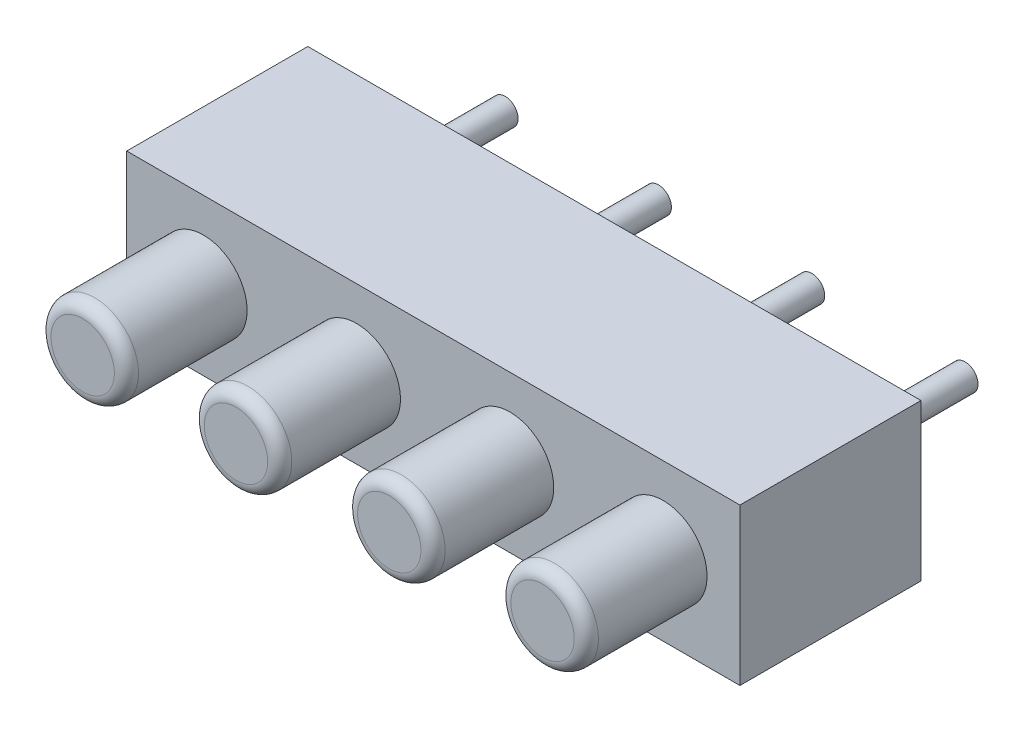
ISO-10303-21;
HEADER;
FILE_DESCRIPTION(('STEP AP214'),'2;1');
FILE_NAME('part.step','',(''),(''),'','','');
FILE_SCHEMA(('AUTOMOTIVE_DESIGN { 1 0 10303 214 1 1 1 1 }'));
ENDSEC;
DATA;
#1=APPLICATION_CONTEXT('core data for automotive mechanical design processes');
#2=APPLICATION_PROTOCOL_DEFINITION('international standard','automotive_design',2000,#1);
#3=PRODUCT_CONTEXT('',#1,'mechanical');
#4=PRODUCT('Part','Part','',(#3));
#5=PRODUCT_RELATED_PRODUCT_CATEGORY('part','',(#4));
#6=PRODUCT_DEFINITION_FORMATION('','',#4);
#7=PRODUCT_DEFINITION_CONTEXT('part definition',#1,'design');
#8=PRODUCT_DEFINITION('design','',#6,#7);
#9=PRODUCT_DEFINITION_SHAPE('','',#8);
#10=(LENGTH_UNIT() NAMED_UNIT(*) SI_UNIT(.MILLI.,.METRE.));
#11=(NAMED_UNIT(*) PLANE_ANGLE_UNIT() SI_UNIT($,.RADIAN.));
#12=(NAMED_UNIT(*) SI_UNIT($,.STERADIAN.) SOLID_ANGLE_UNIT());
#13=UNCERTAINTY_MEASURE_WITH_UNIT(LENGTH_MEASURE(1.E-05),#10,'distance_accuracy_value','');
#14=(GEOMETRIC_REPRESENTATION_CONTEXT(3) GLOBAL_UNCERTAINTY_ASSIGNED_CONTEXT((#13)) GLOBAL_UNIT_ASSIGNED_CONTEXT((#10,
#11,#12)) REPRESENTATION_CONTEXT('',''));
#15=CARTESIAN_POINT('',(0.,0.,0.));
#16=DIRECTION('',(0.,0.,1.));
#17=DIRECTION('',(1.,0.,0.));
#18=AXIS2_PLACEMENT_3D('',#15,#16,#17);
#19=CARTESIAN_POINT('',(0.,0.,0.));
#20=DIRECTION('',(0.,0.,-1.));
#21=DIRECTION('',(-1.,0.,0.));
#22=AXIS2_PLACEMENT_3D('',#19,#20,#21);
#23=PLANE('',#22);
#24=CARTESIAN_POINT('',(6.35,1.295,0.));
#25=DIRECTION('',(0.,0.,-1.));
#26=DIRECTION('',(-1.,0.,0.));
#27=AXIS2_PLACEMENT_3D('',#24,#25,#26);
#28=CIRCLE('',#27,0.215);
#29=CARTESIAN_POINT('',(6.135,1.295,0.));
#30=VERTEX_POINT('',#29);
#31=EDGE_CURVE('E430',#30,#30,#28,.T.);
#32=ORIENTED_EDGE('',*,*,#31,.F.);
#33=EDGE_LOOP('',(#32));
#34=FACE_BOUND('',#33,.T.);
#35=CARTESIAN_POINT('',(1.27,1.295,0.));
#36=DIRECTION('',(0.,0.,-1.));
#37=DIRECTION('',(-1.,0.,0.));
#38=AXIS2_PLACEMENT_3D('',#35,#36,#37);
#39=CIRCLE('',#38,0.215);
#40=CARTESIAN_POINT('',(1.055,1.295,0.));
#41=VERTEX_POINT('',#40);
#42=EDGE_CURVE('E419',#41,#41,#39,.T.);
#43=ORIENTED_EDGE('',*,*,#42,.F.);
#44=EDGE_LOOP('',(#43));
#45=FACE_BOUND('',#44,.T.);
#46=DIRECTION('',(0.,-1.,0.));
#47=VECTOR('',#46,1.);
#48=CARTESIAN_POINT('',(0.,0.,0.));
#49=LINE('',#48,#47);
#50=CARTESIAN_POINT('',(0.,2.59,0.));
#51=VERTEX_POINT('',#50);
#52=CARTESIAN_POINT('',(0.,0.,0.));
#53=VERTEX_POINT('',#52);
#54=EDGE_CURVE('E106',#51,#53,#49,.T.);
#55=ORIENTED_EDGE('',*,*,#54,.F.);
#56=DIRECTION('',(-1.,0.,0.));
#57=VECTOR('',#56,1.);
#58=CARTESIAN_POINT('',(0.,2.59,0.));
#59=LINE('',#58,#57);
#60=CARTESIAN_POINT('',(10.16,2.59,0.));
#61=VERTEX_POINT('',#60);
#62=EDGE_CURVE('E77',#61,#51,#59,.T.);
#63=ORIENTED_EDGE('',*,*,#62,.F.);
#64=DIRECTION('',(0.,1.,0.));
#65=VECTOR('',#64,1.);
#66=CARTESIAN_POINT('',(10.16,0.,0.));
#67=LINE('',#66,#65);
#68=CARTESIAN_POINT('',(10.16,0.,0.));
#69=VERTEX_POINT('',#68);
#70=EDGE_CURVE('E71',#69,#61,#67,.T.);
#71=ORIENTED_EDGE('',*,*,#70,.F.);
#72=DIRECTION('',(1.,0.,0.));
#73=VECTOR('',#72,1.);
#74=CARTESIAN_POINT('',(0.,0.,0.));
#75=LINE('',#74,#73);
#76=EDGE_CURVE('E96',#53,#69,#75,.T.);
#77=ORIENTED_EDGE('',*,*,#76,.F.);
#78=EDGE_LOOP('',(#55,#63,#71,#77));
#79=FACE_BOUND('',#78,.T.);
#80=CARTESIAN_POINT('',(3.81,1.295,0.));
#81=DIRECTION('',(0.,0.,-1.));
#82=DIRECTION('',(-1.,0.,0.));
#83=AXIS2_PLACEMENT_3D('',#80,#81,#82);
#84=CIRCLE('',#83,0.215);
#85=CARTESIAN_POINT('',(3.595,1.295,0.));
#86=VERTEX_POINT('',#85);
#87=EDGE_CURVE('E424',#86,#86,#84,.T.);
#88=ORIENTED_EDGE('',*,*,#87,.F.);
#89=EDGE_LOOP('',(#88));
#90=FACE_BOUND('',#89,.T.);
#91=CARTESIAN_POINT('',(8.89,1.295,0.));
#92=DIRECTION('',(0.,0.,-1.));
#93=DIRECTION('',(-1.,0.,0.));
#94=AXIS2_PLACEMENT_3D('',#91,#92,#93);
#95=CIRCLE('',#94,0.214999999999999);
#96=CARTESIAN_POINT('',(8.675,1.295,0.));
#97=VERTEX_POINT('',#96);
#98=EDGE_CURVE('E436',#97,#97,#95,.T.);
#99=ORIENTED_EDGE('',*,*,#98,.F.);
#100=EDGE_LOOP('',(#99));
#101=FACE_BOUND('',#100,.T.);
#102=ADVANCED_FACE('F37',(#34,#45,#79,#90,#101),#23,.T.);
#103=CARTESIAN_POINT('',(0.,0.,3.));
#104=DIRECTION('',(0.,0.,-1.));
#105=DIRECTION('',(-1.,0.,0.));
#106=AXIS2_PLACEMENT_3D('',#103,#104,#105);
#107=PLANE('',#106);
#108=CARTESIAN_POINT('',(6.35,1.295,3.));
#109=DIRECTION('',(0.,0.,-1.));
#110=DIRECTION('',(-1.,0.,0.));
#111=AXIS2_PLACEMENT_3D('',#108,#109,#110);
#112=CIRCLE('',#111,0.725);
#113=CARTESIAN_POINT('',(5.625,1.295,3.));
#114=VERTEX_POINT('',#113);
#115=EDGE_CURVE('E122',#114,#114,#112,.F.);
#116=ORIENTED_EDGE('',*,*,#115,.F.);
#117=EDGE_LOOP('',(#116));
#118=FACE_BOUND('',#117,.T.);
#119=CARTESIAN_POINT('',(1.27,1.295,3.));
#120=DIRECTION('',(0.,0.,-1.));
#121=DIRECTION('',(-1.,0.,0.));
#122=AXIS2_PLACEMENT_3D('',#119,#120,#121);
#123=CIRCLE('',#122,0.725);
#124=CARTESIAN_POINT('',(0.545000000000001,1.295,3.));
#125=VERTEX_POINT('',#124);
#126=EDGE_CURVE('E116',#125,#125,#123,.F.);
#127=ORIENTED_EDGE('',*,*,#126,.F.);
#128=EDGE_LOOP('',(#127));
#129=FACE_BOUND('',#128,.T.);
#130=DIRECTION('',(0.,-1.,0.));
#131=VECTOR('',#130,1.);
#132=CARTESIAN_POINT('',(0.,0.,3.));
#133=LINE('',#132,#131);
#134=CARTESIAN_POINT('',(0.,2.59,3.));
#135=VERTEX_POINT('',#134);
#136=CARTESIAN_POINT('',(0.,0.,3.));
#137=VERTEX_POINT('',#136);
#138=EDGE_CURVE('E91',#135,#137,#133,.T.);
#139=ORIENTED_EDGE('',*,*,#138,.T.);
#140=DIRECTION('',(1.,0.,0.));
#141=VECTOR('',#140,1.);
#142=CARTESIAN_POINT('',(0.,0.,3.));
#143=LINE('',#142,#141);
#144=CARTESIAN_POINT('',(10.16,0.,3.));
#145=VERTEX_POINT('',#144);
#146=EDGE_CURVE('E85',#137,#145,#143,.T.);
#147=ORIENTED_EDGE('',*,*,#146,.T.);
#148=DIRECTION('',(0.,1.,0.));
#149=VECTOR('',#148,1.);
#150=CARTESIAN_POINT('',(10.16,0.,3.));
#151=LINE('',#150,#149);
#152=CARTESIAN_POINT('',(10.16,2.59,3.));
#153=VERTEX_POINT('',#152);
#154=EDGE_CURVE('E89',#145,#153,#151,.T.);
#155=ORIENTED_EDGE('',*,*,#154,.T.);
#156=DIRECTION('',(-1.,0.,0.));
#157=VECTOR('',#156,1.);
#158=CARTESIAN_POINT('',(0.,2.59,3.));
#159=LINE('',#158,#157);
#160=EDGE_CURVE('E54',#153,#135,#159,.T.);
#161=ORIENTED_EDGE('',*,*,#160,.T.);
#162=EDGE_LOOP('',(#139,#147,#155,#161));
#163=FACE_BOUND('',#162,.T.);
#164=CARTESIAN_POINT('',(3.81,1.295,3.));
#165=DIRECTION('',(0.,0.,-1.));
#166=DIRECTION('',(-1.,0.,0.));
#167=AXIS2_PLACEMENT_3D('',#164,#165,#166);
#168=CIRCLE('',#167,0.725);
#169=CARTESIAN_POINT('',(3.085,1.295,3.));
#170=VERTEX_POINT('',#169);
#171=EDGE_CURVE('E119',#170,#170,#168,.F.);
#172=ORIENTED_EDGE('',*,*,#171,.F.);
#173=EDGE_LOOP('',(#172));
#174=FACE_BOUND('',#173,.T.);
#175=CARTESIAN_POINT('',(8.89,1.295,3.));
#176=DIRECTION('',(0.,0.,-1.));
#177=DIRECTION('',(-1.,0.,0.));
#178=AXIS2_PLACEMENT_3D('',#175,#176,#177);
#179=CIRCLE('',#178,0.725);
#180=CARTESIAN_POINT('',(8.165,1.295,3.));
#181=VERTEX_POINT('',#180);
#182=EDGE_CURVE('E125',#181,#181,#179,.F.);
#183=ORIENTED_EDGE('',*,*,#182,.F.);
#184=EDGE_LOOP('',(#183));
#185=FACE_BOUND('',#184,.T.);
#186=ADVANCED_FACE('F86',(#118,#129,#163,#174,#185),#107,.F.);
#187=CARTESIAN_POINT('',(0.,0.,3.));
#188=DIRECTION('',(1.,0.,0.));
#189=DIRECTION('',(0.,0.,-1.));
#190=AXIS2_PLACEMENT_3D('',#187,#188,#189);
#191=PLANE('',#190);
#192=ORIENTED_EDGE('',*,*,#54,.T.);
#193=DIRECTION('',(0.,0.,-1.));
#194=VECTOR('',#193,1.);
#195=CARTESIAN_POINT('',(0.,0.,3.));
#196=LINE('',#195,#194);
#197=EDGE_CURVE('E97',#137,#53,#196,.T.);
#198=ORIENTED_EDGE('',*,*,#197,.F.);
#199=ORIENTED_EDGE('',*,*,#138,.F.);
#200=DIRECTION('',(0.,0.,-1.));
#201=VECTOR('',#200,1.);
#202=CARTESIAN_POINT('',(0.,2.59,3.));
#203=LINE('',#202,#201);
#204=EDGE_CURVE('E102',#135,#51,#203,.T.);
#205=ORIENTED_EDGE('',*,*,#204,.T.);
#206=EDGE_LOOP('',(#192,#198,#199,#205));
#207=FACE_BOUND('',#206,.T.);
#208=ADVANCED_FACE('F166',(#207),#191,.F.);
#209=CARTESIAN_POINT('',(0.,0.,3.));
#210=DIRECTION('',(0.,1.,0.));
#211=DIRECTION('',(0.,0.,1.));
#212=AXIS2_PLACEMENT_3D('',#209,#210,#211);
#213=PLANE('',#212);
#214=ORIENTED_EDGE('',*,*,#76,.T.);
#215=DIRECTION('',(0.,0.,-1.));
#216=VECTOR('',#215,1.);
#217=CARTESIAN_POINT('',(10.16,0.,3.));
#218=LINE('',#217,#216);
#219=EDGE_CURVE('E94',#145,#69,#218,.T.);
#220=ORIENTED_EDGE('',*,*,#219,.F.);
#221=ORIENTED_EDGE('',*,*,#146,.F.);
#222=ORIENTED_EDGE('',*,*,#197,.T.);
#223=EDGE_LOOP('',(#214,#220,#221,#222));
#224=FACE_BOUND('',#223,.T.);
#225=ADVANCED_FACE('F95',(#224),#213,.F.);
#226=CARTESIAN_POINT('',(10.16,0.,3.));
#227=DIRECTION('',(-1.,0.,0.));
#228=DIRECTION('',(0.,-1.,0.));
#229=AXIS2_PLACEMENT_3D('',#226,#227,#228);
#230=PLANE('',#229);
#231=ORIENTED_EDGE('',*,*,#70,.T.);
#232=DIRECTION('',(0.,0.,-1.));
#233=VECTOR('',#232,1.);
#234=CARTESIAN_POINT('',(10.16,2.59,3.));
#235=LINE('',#234,#233);
#236=EDGE_CURVE('E98',#153,#61,#235,.T.);
#237=ORIENTED_EDGE('',*,*,#236,.F.);
#238=ORIENTED_EDGE('',*,*,#154,.F.);
#239=ORIENTED_EDGE('',*,*,#219,.T.);
#240=EDGE_LOOP('',(#231,#237,#238,#239));
#241=FACE_BOUND('',#240,.T.);
#242=ADVANCED_FACE('F100',(#241),#230,.F.);
#243=CARTESIAN_POINT('',(0.,2.59,3.));
#244=DIRECTION('',(0.,-1.,0.));
#245=DIRECTION('',(0.,0.,-1.));
#246=AXIS2_PLACEMENT_3D('',#243,#244,#245);
#247=PLANE('',#246);
#248=ORIENTED_EDGE('',*,*,#62,.T.);
#249=ORIENTED_EDGE('',*,*,#204,.F.);
#250=ORIENTED_EDGE('',*,*,#160,.F.);
#251=ORIENTED_EDGE('',*,*,#236,.T.);
#252=EDGE_LOOP('',(#248,#249,#250,#251));
#253=FACE_BOUND('',#252,.T.);
#254=ADVANCED_FACE('F173',(#253),#247,.F.);
#255=CARTESIAN_POINT('',(1.27,1.295,12.050609665441));
#256=DIRECTION('',(0.,0.,-1.));
#257=DIRECTION('',(-1.,0.,0.));
#258=AXIS2_PLACEMENT_3D('',#255,#256,#257);
#259=CYLINDRICAL_SURFACE('',#258,0.725);
#260=CARTESIAN_POINT('',(1.27,1.295,4.8));
#261=DIRECTION('',(0.,0.,-1.));
#262=DIRECTION('',(-1.,0.,0.));
#263=AXIS2_PLACEMENT_3D('',#260,#261,#262);
#264=CIRCLE('',#263,0.725);
#265=CARTESIAN_POINT('',(0.545000000000001,1.295,4.8));
#266=VERTEX_POINT('',#265);
#267=EDGE_CURVE('E128',#266,#266,#264,.T.);
#268=ORIENTED_EDGE('',*,*,#267,.T.);
#269=EDGE_LOOP('',(#268));
#270=FACE_BOUND('',#269,.T.);
#271=ORIENTED_EDGE('',*,*,#126,.T.);
#272=EDGE_LOOP('',(#271));
#273=FACE_BOUND('',#272,.T.);
#274=ADVANCED_FACE('F176',(#270,#273),#259,.T.);
#275=CARTESIAN_POINT('',(0.,0.,5.));
#276=DIRECTION('',(0.,0.,-1.));
#277=DIRECTION('',(-1.,0.,0.));
#278=AXIS2_PLACEMENT_3D('',#275,#276,#277);
#279=PLANE('',#278);
#280=CARTESIAN_POINT('',(1.27,1.295,5.));
#281=DIRECTION('',(0.,0.,-1.));
#282=DIRECTION('',(-1.,0.,0.));
#283=AXIS2_PLACEMENT_3D('',#280,#281,#282);
#284=CIRCLE('',#283,0.525);
#285=CARTESIAN_POINT('',(0.745000000000001,1.295,5.));
#286=VERTEX_POINT('',#285);
#287=EDGE_CURVE('E131',#286,#286,#284,.F.);
#288=ORIENTED_EDGE('',*,*,#287,.T.);
#289=EDGE_LOOP('',(#288));
#290=FACE_BOUND('',#289,.T.);
#291=ADVANCED_FACE('F201',(#290),#279,.F.);
#292=CARTESIAN_POINT('',(3.81,1.295,12.050609665441));
#293=DIRECTION('',(0.,0.,-1.));
#294=DIRECTION('',(-1.,0.,0.));
#295=AXIS2_PLACEMENT_3D('',#292,#293,#294);
#296=CYLINDRICAL_SURFACE('',#295,0.725);
#297=CARTESIAN_POINT('',(3.81,1.295,4.8));
#298=DIRECTION('',(0.,0.,-1.));
#299=DIRECTION('',(-1.,0.,0.));
#300=AXIS2_PLACEMENT_3D('',#297,#298,#299);
#301=CIRCLE('',#300,0.725);
#302=CARTESIAN_POINT('',(3.085,1.295,4.8));
#303=VERTEX_POINT('',#302);
#304=EDGE_CURVE('E134',#303,#303,#301,.T.);
#305=ORIENTED_EDGE('',*,*,#304,.T.);
#306=EDGE_LOOP('',(#305));
#307=FACE_BOUND('',#306,.T.);
#308=ORIENTED_EDGE('',*,*,#171,.T.);
#309=EDGE_LOOP('',(#308));
#310=FACE_BOUND('',#309,.T.);
#311=ADVANCED_FACE('F197',(#307,#310),#296,.T.);
#312=CARTESIAN_POINT('',(0.,0.,5.));
#313=DIRECTION('',(0.,0.,-1.));
#314=DIRECTION('',(-1.,0.,0.));
#315=AXIS2_PLACEMENT_3D('',#312,#313,#314);
#316=PLANE('',#315);
#317=CARTESIAN_POINT('',(3.81,1.295,5.));
#318=DIRECTION('',(0.,0.,-1.));
#319=DIRECTION('',(-1.,0.,0.));
#320=AXIS2_PLACEMENT_3D('',#317,#318,#319);
#321=CIRCLE('',#320,0.525);
#322=CARTESIAN_POINT('',(3.285,1.295,5.));
#323=VERTEX_POINT('',#322);
#324=EDGE_CURVE('E137',#323,#323,#321,.F.);
#325=ORIENTED_EDGE('',*,*,#324,.T.);
#326=EDGE_LOOP('',(#325));
#327=FACE_BOUND('',#326,.T.);
#328=ADVANCED_FACE('F200',(#327),#316,.F.);
#329=CARTESIAN_POINT('',(6.35,1.295,12.050609665441));
#330=DIRECTION('',(0.,0.,-1.));
#331=DIRECTION('',(-1.,0.,0.));
#332=AXIS2_PLACEMENT_3D('',#329,#330,#331);
#333=CYLINDRICAL_SURFACE('',#332,0.725);
#334=CARTESIAN_POINT('',(6.35,1.295,4.8));
#335=DIRECTION('',(0.,0.,-1.));
#336=DIRECTION('',(-1.,0.,0.));
#337=AXIS2_PLACEMENT_3D('',#334,#335,#336);
#338=CIRCLE('',#337,0.725);
#339=CARTESIAN_POINT('',(5.625,1.295,4.8));
#340=VERTEX_POINT('',#339);
#341=EDGE_CURVE('E140',#340,#340,#338,.T.);
#342=ORIENTED_EDGE('',*,*,#341,.T.);
#343=EDGE_LOOP('',(#342));
#344=FACE_BOUND('',#343,.T.);
#345=ORIENTED_EDGE('',*,*,#115,.T.);
#346=EDGE_LOOP('',(#345));
#347=FACE_BOUND('',#346,.T.);
#348=ADVANCED_FACE('F217',(#344,#347),#333,.T.);
#349=CARTESIAN_POINT('',(0.,0.,5.));
#350=DIRECTION('',(0.,0.,-1.));
#351=DIRECTION('',(-1.,0.,0.));
#352=AXIS2_PLACEMENT_3D('',#349,#350,#351);
#353=PLANE('',#352);
#354=CARTESIAN_POINT('',(6.35,1.295,5.));
#355=DIRECTION('',(0.,0.,-1.));
#356=DIRECTION('',(-1.,0.,0.));
#357=AXIS2_PLACEMENT_3D('',#354,#355,#356);
#358=CIRCLE('',#357,0.525);
#359=CARTESIAN_POINT('',(5.825,1.295,5.));
#360=VERTEX_POINT('',#359);
#361=EDGE_CURVE('E143',#360,#360,#358,.F.);
#362=ORIENTED_EDGE('',*,*,#361,.T.);
#363=EDGE_LOOP('',(#362));
#364=FACE_BOUND('',#363,.T.);
#365=ADVANCED_FACE('F208',(#364),#353,.F.);
#366=CARTESIAN_POINT('',(8.89,1.295,12.050609665441));
#367=DIRECTION('',(0.,0.,-1.));
#368=DIRECTION('',(-1.,0.,0.));
#369=AXIS2_PLACEMENT_3D('',#366,#367,#368);
#370=CYLINDRICAL_SURFACE('',#369,0.725);
#371=CARTESIAN_POINT('',(8.89,1.295,4.8));
#372=DIRECTION('',(0.,0.,-1.));
#373=DIRECTION('',(-1.,0.,0.));
#374=AXIS2_PLACEMENT_3D('',#371,#372,#373);
#375=CIRCLE('',#374,0.725);
#376=CARTESIAN_POINT('',(8.165,1.295,4.8));
#377=VERTEX_POINT('',#376);
#378=EDGE_CURVE('E46',#377,#377,#375,.T.);
#379=ORIENTED_EDGE('',*,*,#378,.T.);
#380=EDGE_LOOP('',(#379));
#381=FACE_BOUND('',#380,.T.);
#382=ORIENTED_EDGE('',*,*,#182,.T.);
#383=EDGE_LOOP('',(#382));
#384=FACE_BOUND('',#383,.T.);
#385=ADVANCED_FACE('F148',(#381,#384),#370,.T.);
#386=CARTESIAN_POINT('',(0.,0.,5.));
#387=DIRECTION('',(0.,0.,-1.));
#388=DIRECTION('',(-1.,0.,0.));
#389=AXIS2_PLACEMENT_3D('',#386,#387,#388);
#390=PLANE('',#389);
#391=CARTESIAN_POINT('',(8.89,1.295,5.));
#392=DIRECTION('',(0.,0.,-1.));
#393=DIRECTION('',(-1.,0.,0.));
#394=AXIS2_PLACEMENT_3D('',#391,#392,#393);
#395=CIRCLE('',#394,0.525);
#396=CARTESIAN_POINT('',(8.365,1.295,5.));
#397=VERTEX_POINT('',#396);
#398=EDGE_CURVE('E12',#397,#397,#395,.F.);
#399=ORIENTED_EDGE('',*,*,#398,.T.);
#400=EDGE_LOOP('',(#399));
#401=FACE_BOUND('',#400,.T.);
#402=ADVANCED_FACE('F207',(#401),#390,.F.);
#403=CARTESIAN_POINT('',(1.27,1.295,-2.));
#404=DIRECTION('',(0.,0.,1.));
#405=DIRECTION('',(1.,0.,0.));
#406=AXIS2_PLACEMENT_3D('',#403,#404,#405);
#407=CYLINDRICAL_SURFACE('',#406,0.215);
#408=CARTESIAN_POINT('',(1.27,1.295,-2.));
#409=DIRECTION('',(0.,0.,-1.));
#410=DIRECTION('',(-1.,0.,0.));
#411=AXIS2_PLACEMENT_3D('',#408,#409,#410);
#412=CIRCLE('',#411,0.215);
#413=CARTESIAN_POINT('',(1.055,1.295,-2.));
#414=VERTEX_POINT('',#413);
#415=EDGE_CURVE('E109',#414,#414,#412,.T.);
#416=ORIENTED_EDGE('',*,*,#415,.F.);
#417=EDGE_LOOP('',(#416));
#418=FACE_BOUND('',#417,.T.);
#419=ORIENTED_EDGE('',*,*,#42,.T.);
#420=EDGE_LOOP('',(#419));
#421=FACE_BOUND('',#420,.T.);
#422=ADVANCED_FACE('F214',(#418,#421),#407,.T.);
#423=CARTESIAN_POINT('',(1.27,1.295,-2.));
#424=DIRECTION('',(0.,0.,-1.));
#425=DIRECTION('',(-1.,0.,0.));
#426=AXIS2_PLACEMENT_3D('',#423,#424,#425);
#427=PLANE('',#426);
#428=ORIENTED_EDGE('',*,*,#415,.T.);
#429=EDGE_LOOP('',(#428));
#430=FACE_BOUND('',#429,.T.);
#431=ADVANCED_FACE('F341',(#430),#427,.T.);
#432=CARTESIAN_POINT('',(3.81,1.295,-2.));
#433=DIRECTION('',(0.,0.,1.));
#434=DIRECTION('',(1.,0.,0.));
#435=AXIS2_PLACEMENT_3D('',#432,#433,#434);
#436=CYLINDRICAL_SURFACE('',#435,0.215);
#437=CARTESIAN_POINT('',(3.81,1.295,-2.));
#438=DIRECTION('',(0.,0.,-1.));
#439=DIRECTION('',(-1.,0.,0.));
#440=AXIS2_PLACEMENT_3D('',#437,#438,#439);
#441=CIRCLE('',#440,0.215);
#442=CARTESIAN_POINT('',(3.595,1.295,-2.));
#443=VERTEX_POINT('',#442);
#444=EDGE_CURVE('E420',#443,#443,#441,.T.);
#445=ORIENTED_EDGE('',*,*,#444,.F.);
#446=EDGE_LOOP('',(#445));
#447=FACE_BOUND('',#446,.T.);
#448=ORIENTED_EDGE('',*,*,#87,.T.);
#449=EDGE_LOOP('',(#448));
#450=FACE_BOUND('',#449,.T.);
#451=ADVANCED_FACE('F333',(#447,#450),#436,.T.);
#452=CARTESIAN_POINT('',(3.81,1.295,-2.));
#453=DIRECTION('',(0.,0.,-1.));
#454=DIRECTION('',(-1.,0.,0.));
#455=AXIS2_PLACEMENT_3D('',#452,#453,#454);
#456=PLANE('',#455);
#457=ORIENTED_EDGE('',*,*,#444,.T.);
#458=EDGE_LOOP('',(#457));
#459=FACE_BOUND('',#458,.T.);
#460=ADVANCED_FACE('F325',(#459),#456,.T.);
#461=CARTESIAN_POINT('',(6.35,1.295,-2.));
#462=DIRECTION('',(0.,0.,1.));
#463=DIRECTION('',(1.,0.,0.));
#464=AXIS2_PLACEMENT_3D('',#461,#462,#463);
#465=CYLINDRICAL_SURFACE('',#464,0.215);
#466=CARTESIAN_POINT('',(6.35,1.295,-2.));
#467=DIRECTION('',(0.,0.,-1.));
#468=DIRECTION('',(-1.,0.,0.));
#469=AXIS2_PLACEMENT_3D('',#466,#467,#468);
#470=CIRCLE('',#469,0.215);
#471=CARTESIAN_POINT('',(6.135,1.295,-2.));
#472=VERTEX_POINT('',#471);
#473=EDGE_CURVE('E428',#472,#472,#470,.T.);
#474=ORIENTED_EDGE('',*,*,#473,.F.);
#475=EDGE_LOOP('',(#474));
#476=FACE_BOUND('',#475,.T.);
#477=ORIENTED_EDGE('',*,*,#31,.T.);
#478=EDGE_LOOP('',(#477));
#479=FACE_BOUND('',#478,.T.);
#480=ADVANCED_FACE('F317',(#476,#479),#465,.T.);
#481=CARTESIAN_POINT('',(6.35,1.295,-2.));
#482=DIRECTION('',(0.,0.,-1.));
#483=DIRECTION('',(-1.,0.,0.));
#484=AXIS2_PLACEMENT_3D('',#481,#482,#483);
#485=PLANE('',#484);
#486=ORIENTED_EDGE('',*,*,#473,.T.);
#487=EDGE_LOOP('',(#486));
#488=FACE_BOUND('',#487,.T.);
#489=ADVANCED_FACE('F309',(#488),#485,.T.);
#490=CARTESIAN_POINT('',(8.89,1.295,-2.));
#491=DIRECTION('',(0.,0.,1.));
#492=DIRECTION('',(1.,0.,0.));
#493=AXIS2_PLACEMENT_3D('',#490,#491,#492);
#494=CYLINDRICAL_SURFACE('',#493,0.214999999999999);
#495=CARTESIAN_POINT('',(8.89,1.295,-2.));
#496=DIRECTION('',(0.,0.,-1.));
#497=DIRECTION('',(-1.,0.,0.));
#498=AXIS2_PLACEMENT_3D('',#495,#496,#497);
#499=CIRCLE('',#498,0.214999999999999);
#500=CARTESIAN_POINT('',(8.675,1.295,-2.));
#501=VERTEX_POINT('',#500);
#502=EDGE_CURVE('E433',#501,#501,#499,.T.);
#503=ORIENTED_EDGE('',*,*,#502,.F.);
#504=EDGE_LOOP('',(#503));
#505=FACE_BOUND('',#504,.T.);
#506=ORIENTED_EDGE('',*,*,#98,.T.);
#507=EDGE_LOOP('',(#506));
#508=FACE_BOUND('',#507,.T.);
#509=ADVANCED_FACE('F302',(#505,#508),#494,.T.);
#510=CARTESIAN_POINT('',(8.89,1.295,-2.));
#511=DIRECTION('',(0.,0.,-1.));
#512=DIRECTION('',(-1.,0.,0.));
#513=AXIS2_PLACEMENT_3D('',#510,#511,#512);
#514=PLANE('',#513);
#515=ORIENTED_EDGE('',*,*,#502,.T.);
#516=EDGE_LOOP('',(#515));
#517=FACE_BOUND('',#516,.T.);
#518=ADVANCED_FACE('F187',(#517),#514,.T.);
#519=CARTESIAN_POINT('',(1.27,1.295,4.8));
#520=DIRECTION('',(0.,0.,-1.));
#521=DIRECTION('',(-1.,0.,0.));
#522=AXIS2_PLACEMENT_3D('',#519,#520,#521);
#523=TOROIDAL_SURFACE('',#522,0.525,0.2);
#524=ORIENTED_EDGE('',*,*,#287,.F.);
#525=EDGE_LOOP('',(#524));
#526=FACE_BOUND('',#525,.T.);
#527=ORIENTED_EDGE('',*,*,#267,.F.);
#528=EDGE_LOOP('',(#527));
#529=FACE_BOUND('',#528,.T.);
#530=ADVANCED_FACE('F184',(#526,#529),#523,.T.);
#531=CARTESIAN_POINT('',(3.81,1.295,4.8));
#532=DIRECTION('',(0.,0.,-1.));
#533=DIRECTION('',(-1.,0.,0.));
#534=AXIS2_PLACEMENT_3D('',#531,#532,#533);
#535=TOROIDAL_SURFACE('',#534,0.525,0.2);
#536=ORIENTED_EDGE('',*,*,#324,.F.);
#537=EDGE_LOOP('',(#536));
#538=FACE_BOUND('',#537,.T.);
#539=ORIENTED_EDGE('',*,*,#304,.F.);
#540=EDGE_LOOP('',(#539));
#541=FACE_BOUND('',#540,.T.);
#542=ADVANCED_FACE('F157',(#538,#541),#535,.T.);
#543=CARTESIAN_POINT('',(6.35,1.295,4.8));
#544=DIRECTION('',(0.,0.,-1.));
#545=DIRECTION('',(-1.,0.,0.));
#546=AXIS2_PLACEMENT_3D('',#543,#544,#545);
#547=TOROIDAL_SURFACE('',#546,0.525,0.2);
#548=ORIENTED_EDGE('',*,*,#361,.F.);
#549=EDGE_LOOP('',(#548));
#550=FACE_BOUND('',#549,.T.);
#551=ORIENTED_EDGE('',*,*,#341,.F.);
#552=EDGE_LOOP('',(#551));
#553=FACE_BOUND('',#552,.T.);
#554=ADVANCED_FACE('F152',(#550,#553),#547,.T.);
#555=CARTESIAN_POINT('',(8.89,1.295,4.8));
#556=DIRECTION('',(0.,0.,-1.));
#557=DIRECTION('',(-1.,0.,0.));
#558=AXIS2_PLACEMENT_3D('',#555,#556,#557);
#559=TOROIDAL_SURFACE('',#558,0.525,0.2);
#560=ORIENTED_EDGE('',*,*,#398,.F.);
#561=EDGE_LOOP('',(#560));
#562=FACE_BOUND('',#561,.T.);
#563=ORIENTED_EDGE('',*,*,#378,.F.);
#564=EDGE_LOOP('',(#563));
#565=FACE_BOUND('',#564,.T.);
#566=ADVANCED_FACE('F39',(#562,#565),#559,.T.);
#567=CLOSED_SHELL('',(#102,#186,#208,#225,#242,#254,#274,#291,#311,#328,#348,#365,#385,#402,
#422,#431,#451,#460,#480,#489,#509,#518,#530,#542,#554,#566));
#568=MANIFOLD_SOLID_BREP('B2',#567);
#569=ADVANCED_BREP_SHAPE_REPRESENTATION('',(#18,#568),#14);
#570=SHAPE_DEFINITION_REPRESENTATION(#9,#569);
ENDSEC;
END-ISO-10303-21;
